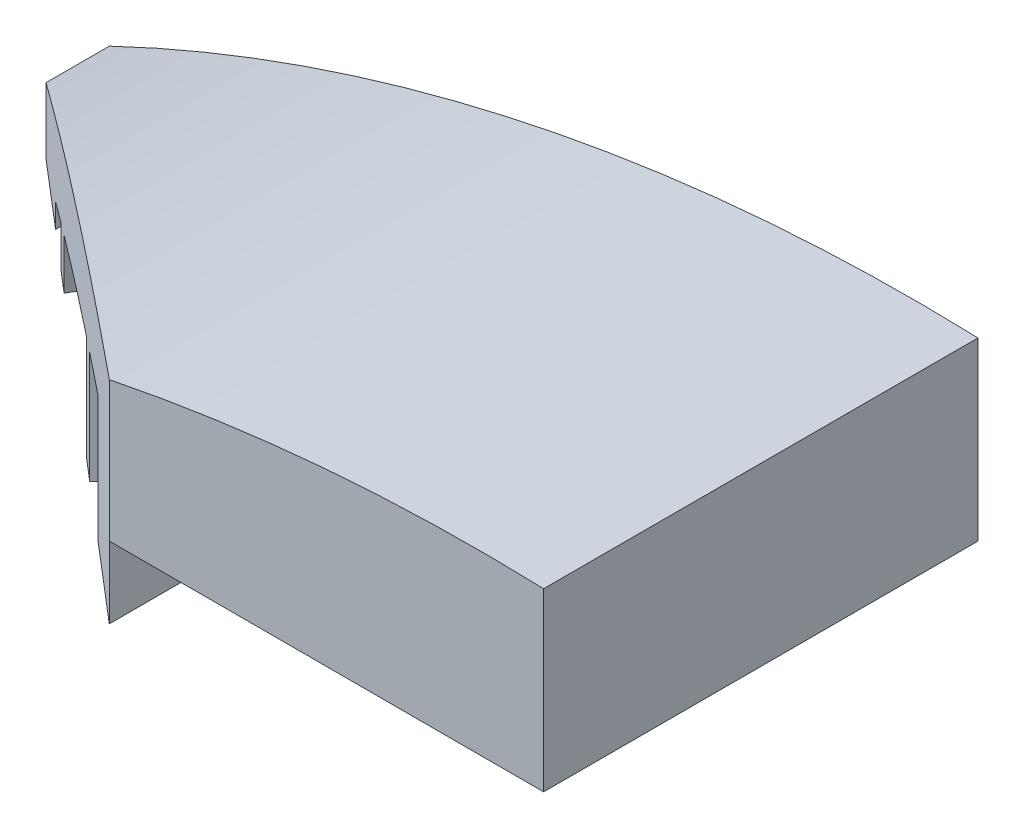
ISO-10303-21;
HEADER;
FILE_DESCRIPTION(('STEP AP214'),'2;1');
FILE_NAME('part.step','',(''),(''),'','','');
FILE_SCHEMA(('AUTOMOTIVE_DESIGN { 1 0 10303 214 1 1 1 1 }'));
ENDSEC;
DATA;
#1=APPLICATION_CONTEXT('core data for automotive mechanical design processes');
#2=APPLICATION_PROTOCOL_DEFINITION('international standard','automotive_design',2000,#1);
#3=PRODUCT_CONTEXT('',#1,'mechanical');
#4=PRODUCT('Part','Part','',(#3));
#5=PRODUCT_RELATED_PRODUCT_CATEGORY('part','',(#4));
#6=PRODUCT_DEFINITION_FORMATION('','',#4);
#7=PRODUCT_DEFINITION_CONTEXT('part definition',#1,'design');
#8=PRODUCT_DEFINITION('design','',#6,#7);
#9=PRODUCT_DEFINITION_SHAPE('','',#8);
#10=(LENGTH_UNIT() NAMED_UNIT(*) SI_UNIT(.MILLI.,.METRE.));
#11=(NAMED_UNIT(*) PLANE_ANGLE_UNIT() SI_UNIT($,.RADIAN.));
#12=(NAMED_UNIT(*) SI_UNIT($,.STERADIAN.) SOLID_ANGLE_UNIT());
#13=UNCERTAINTY_MEASURE_WITH_UNIT(LENGTH_MEASURE(1.E-05),#10,'distance_accuracy_value','');
#14=(GEOMETRIC_REPRESENTATION_CONTEXT(3) GLOBAL_UNCERTAINTY_ASSIGNED_CONTEXT((#13)) GLOBAL_UNIT_ASSIGNED_CONTEXT((#10,
#11,#12)) REPRESENTATION_CONTEXT('',''));
#15=CARTESIAN_POINT('',(0.,0.,0.));
#16=DIRECTION('',(0.,0.,1.));
#17=DIRECTION('',(1.,0.,0.));
#18=AXIS2_PLACEMENT_3D('',#15,#16,#17);
#19=CARTESIAN_POINT('',(-7.9,1.03720809548521,3.95));
#20=DIRECTION('',(0.,1.,0.));
#21=DIRECTION('',(0.,0.,1.));
#22=AXIS2_PLACEMENT_3D('',#19,#20,#21);
#23=PLANE('',#22);
#24=DIRECTION('',(0.,0.,-1.));
#25=VECTOR('',#24,1.);
#26=CARTESIAN_POINT('',(0.,1.03720809548521,3.95));
#27=LINE('',#26,#25);
#28=CARTESIAN_POINT('',(0.,1.03720809548521,3.95));
#29=VERTEX_POINT('',#28);
#30=CARTESIAN_POINT('',(0.,1.03720809548521,-3.95));
#31=VERTEX_POINT('',#30);
#32=EDGE_CURVE('E260',#29,#31,#27,.T.);
#33=ORIENTED_EDGE('',*,*,#32,.F.);
#34=DIRECTION('',(-0.760337182849053,0.,-0.649528573949727));
#35=VECTOR('',#34,1.);
#36=CARTESIAN_POINT('',(-4.5670897898204,1.03720809548521,0.0485002638345054));
#37=LINE('',#36,#35);
#38=CARTESIAN_POINT('',(-1.40471821566003,1.03720809548521,2.75));
#39=VERTEX_POINT('',#38);
#40=EDGE_CURVE('E224',#29,#39,#37,.T.);
#41=ORIENTED_EDGE('',*,*,#40,.T.);
#42=DIRECTION('',(1.,0.,0.));
#43=VECTOR('',#42,1.);
#44=CARTESIAN_POINT('',(6.73873493519161,1.03720809548521,2.75));
#45=LINE('',#44,#43);
#46=CARTESIAN_POINT('',(-1.2,1.03720809548521,2.75));
#47=VERTEX_POINT('',#46);
#48=EDGE_CURVE('E314',#39,#47,#45,.T.);
#49=ORIENTED_EDGE('',*,*,#48,.T.);
#50=DIRECTION('',(0.,0.,-1.));
#51=VECTOR('',#50,1.);
#52=CARTESIAN_POINT('',(-1.2,1.03720809548521,3.95));
#53=LINE('',#52,#51);
#54=CARTESIAN_POINT('',(-1.2,1.03720809548521,-2.75));
#55=VERTEX_POINT('',#54);
#56=EDGE_CURVE('E309',#47,#55,#53,.T.);
#57=ORIENTED_EDGE('',*,*,#56,.T.);
#58=DIRECTION('',(1.,0.,0.));
#59=VECTOR('',#58,1.);
#60=CARTESIAN_POINT('',(6.73873493519161,1.03720809548521,-2.75));
#61=LINE('',#60,#59);
#62=CARTESIAN_POINT('',(-6.7,1.03720809548521,-2.75));
#63=VERTEX_POINT('',#62);
#64=EDGE_CURVE('E306',#63,#55,#61,.T.);
#65=ORIENTED_EDGE('',*,*,#64,.F.);
#66=DIRECTION('',(0.,0.,-1.));
#67=VECTOR('',#66,1.);
#68=CARTESIAN_POINT('',(-6.7,1.03720809548521,3.95));
#69=LINE('',#68,#67);
#70=CARTESIAN_POINT('',(-6.7,1.03720809548521,-1.77356783756967));
#71=VERTEX_POINT('',#70);
#72=EDGE_CURVE('E330',#71,#63,#69,.T.);
#73=ORIENTED_EDGE('',*,*,#72,.F.);
#74=CARTESIAN_POINT('',(-7.9,1.03720809548521,-2.79868446519408));
#75=VERTEX_POINT('',#74);
#76=EDGE_CURVE('E374',#71,#75,#37,.T.);
#77=ORIENTED_EDGE('',*,*,#76,.T.);
#78=DIRECTION('',(0.,0.,-1.));
#79=VECTOR('',#78,1.);
#80=CARTESIAN_POINT('',(-7.9,1.03720809548521,3.95));
#81=LINE('',#80,#79);
#82=CARTESIAN_POINT('',(-7.9,1.03720809548521,-3.95));
#83=VERTEX_POINT('',#82);
#84=EDGE_CURVE('E263',#75,#83,#81,.T.);
#85=ORIENTED_EDGE('',*,*,#84,.T.);
#86=DIRECTION('',(1.,0.,0.));
#87=VECTOR('',#86,1.);
#88=CARTESIAN_POINT('',(-7.9,1.03720809548521,-3.95));
#89=LINE('',#88,#87);
#90=EDGE_CURVE('E240',#83,#31,#89,.T.);
#91=ORIENTED_EDGE('',*,*,#90,.T.);
#92=EDGE_LOOP('',(#33,#41,#49,#57,#65,#73,#77,#85,#91));
#93=FACE_BOUND('',#92,.T.);
#94=ADVANCED_FACE('F53',(#93),#23,.F.);
#95=CARTESIAN_POINT('',(-7.9,1.03720809548521,3.95));
#96=DIRECTION('',(1.,0.,0.));
#97=DIRECTION('',(0.,0.,-1.));
#98=AXIS2_PLACEMENT_3D('',#95,#96,#97);
#99=PLANE('',#98);
#100=ORIENTED_EDGE('',*,*,#84,.F.);
#101=DIRECTION('',(0.,-1.,0.));
#102=VECTOR('',#101,1.);
#103=CARTESIAN_POINT('',(-7.9,5.56078833662162,-2.79868446519408));
#104=LINE('',#103,#102);
#105=CARTESIAN_POINT('',(-7.9,2.23720809548521,-2.79868446519408));
#106=VERTEX_POINT('',#105);
#107=EDGE_CURVE('E213',#106,#75,#104,.T.);
#108=ORIENTED_EDGE('',*,*,#107,.F.);
#109=DIRECTION('',(0.,0.,-1.));
#110=VECTOR('',#109,1.);
#111=CARTESIAN_POINT('',(-7.9,2.23720809548521,3.95));
#112=LINE('',#111,#110);
#113=CARTESIAN_POINT('',(-7.9,2.23720809548521,-3.95));
#114=VERTEX_POINT('',#113);
#115=EDGE_CURVE('E222',#106,#114,#112,.T.);
#116=ORIENTED_EDGE('',*,*,#115,.T.);
#117=DIRECTION('',(0.,-1.,0.));
#118=VECTOR('',#117,1.);
#119=CARTESIAN_POINT('',(-7.9,1.03720809548521,-3.95));
#120=LINE('',#119,#118);
#121=EDGE_CURVE('E237',#114,#83,#120,.T.);
#122=ORIENTED_EDGE('',*,*,#121,.T.);
#123=EDGE_LOOP('',(#100,#108,#116,#122));
#124=FACE_BOUND('',#123,.T.);
#125=ADVANCED_FACE('F55',(#124),#99,.F.);
#126=CARTESIAN_POINT('',(0.,1.03720809548521,3.95));
#127=DIRECTION('',(-1.,0.,0.));
#128=DIRECTION('',(0.,0.,1.));
#129=AXIS2_PLACEMENT_3D('',#126,#127,#128);
#130=PLANE('',#129);
#131=DIRECTION('',(0.,1.,0.));
#132=VECTOR('',#131,1.);
#133=CARTESIAN_POINT('',(0.,1.03720809548521,-3.95));
#134=LINE('',#133,#132);
#135=CARTESIAN_POINT('',(0.,2.34089257913856,-3.95));
#136=VERTEX_POINT('',#135);
#137=EDGE_CURVE('E243',#31,#136,#134,.T.);
#138=ORIENTED_EDGE('',*,*,#137,.T.);
#139=DIRECTION('',(0.,0.,-1.));
#140=VECTOR('',#139,1.);
#141=CARTESIAN_POINT('',(0.,2.34089257913856,3.95));
#142=LINE('',#141,#140);
#143=CARTESIAN_POINT('',(0.,2.34089257913856,-2.76982131033317));
#144=VERTEX_POINT('',#143);
#145=EDGE_CURVE('E256',#144,#136,#142,.T.);
#146=ORIENTED_EDGE('',*,*,#145,.F.);
#147=DIRECTION('',(0.,-1.,0.));
#148=VECTOR('',#147,1.);
#149=CARTESIAN_POINT('',(0.,4.74089257913856,-2.76982131033317));
#150=LINE('',#149,#148);
#151=CARTESIAN_POINT('',(0.,4.74089257913856,-2.76982131033317));
#152=VERTEX_POINT('',#151);
#153=EDGE_CURVE('E75',#152,#144,#150,.T.);
#154=ORIENTED_EDGE('',*,*,#153,.F.);
#155=DIRECTION('',(0.,0.,-1.));
#156=VECTOR('',#155,1.);
#157=CARTESIAN_POINT('',(0.,4.74089257913856,2.81210865858254));
#158=LINE('',#157,#156);
#159=CARTESIAN_POINT('',(0.,4.74089257913856,2.81210865858254));
#160=VERTEX_POINT('',#159);
#161=EDGE_CURVE('E389',#160,#152,#158,.T.);
#162=ORIENTED_EDGE('',*,*,#161,.F.);
#163=DIRECTION('',(0.,-1.,0.));
#164=VECTOR('',#163,1.);
#165=CARTESIAN_POINT('',(0.,4.74089257913856,2.81210865858254));
#166=LINE('',#165,#164);
#167=CARTESIAN_POINT('',(0.,2.34089257913856,2.81210865858254));
#168=VERTEX_POINT('',#167);
#169=EDGE_CURVE('E408',#160,#168,#166,.T.);
#170=ORIENTED_EDGE('',*,*,#169,.T.);
#171=CARTESIAN_POINT('',(0.,2.34089257913856,3.95));
#172=VERTEX_POINT('',#171);
#173=EDGE_CURVE('E257',#172,#168,#142,.T.);
#174=ORIENTED_EDGE('',*,*,#173,.F.);
#175=DIRECTION('',(0.,1.,0.));
#176=VECTOR('',#175,1.);
#177=CARTESIAN_POINT('',(0.,1.03720809548521,3.95));
#178=LINE('',#177,#176);
#179=EDGE_CURVE('E209',#29,#172,#178,.T.);
#180=ORIENTED_EDGE('',*,*,#179,.F.);
#181=ORIENTED_EDGE('',*,*,#32,.T.);
#182=EDGE_LOOP('',(#138,#146,#154,#162,#170,#174,#180,#181));
#183=FACE_BOUND('',#182,.T.);
#184=DIRECTION('',(0.,0.,1.));
#185=VECTOR('',#184,1.);
#186=CARTESIAN_POINT('',(0.,3.54089257913856,3.95));
#187=LINE('',#186,#185);
#188=CARTESIAN_POINT('',(0.,3.54089257913856,-2.75));
#189=VERTEX_POINT('',#188);
#190=CARTESIAN_POINT('',(0.,3.54089257913856,2.75));
#191=VERTEX_POINT('',#190);
#192=EDGE_CURVE('E417',#189,#191,#187,.T.);
#193=ORIENTED_EDGE('',*,*,#192,.T.);
#194=DIRECTION('',(0.,1.,0.));
#195=VECTOR('',#194,1.);
#196=CARTESIAN_POINT('',(0.,-28.339212531873,2.75));
#197=LINE('',#196,#195);
#198=CARTESIAN_POINT('',(0.,3.65890472950313,2.75));
#199=VERTEX_POINT('',#198);
#200=EDGE_CURVE('E273',#191,#199,#197,.T.);
#201=ORIENTED_EDGE('',*,*,#200,.T.);
#202=DIRECTION('',(0.,0.,-1.));
#203=VECTOR('',#202,1.);
#204=CARTESIAN_POINT('',(0.,3.65890472950313,3.95));
#205=LINE('',#204,#203);
#206=CARTESIAN_POINT('',(0.,3.65890472950313,-2.75));
#207=VERTEX_POINT('',#206);
#208=EDGE_CURVE('E410',#199,#207,#205,.T.);
#209=ORIENTED_EDGE('',*,*,#208,.T.);
#210=DIRECTION('',(0.,1.,0.));
#211=VECTOR('',#210,1.);
#212=CARTESIAN_POINT('',(0.,-28.339212531873,-2.75));
#213=LINE('',#212,#211);
#214=EDGE_CURVE('E419',#189,#207,#213,.T.);
#215=ORIENTED_EDGE('',*,*,#214,.F.);
#216=EDGE_LOOP('',(#193,#201,#209,#215));
#217=FACE_BOUND('',#216,.T.);
#218=ADVANCED_FACE('F453',(#183,#217),#130,.F.);
#219=CARTESIAN_POINT('',(0.,2.34089257913856,3.95));
#220=DIRECTION('',(0.,1.,0.));
#221=DIRECTION('',(0.,0.,1.));
#222=AXIS2_PLACEMENT_3D('',#219,#220,#221);
#223=PLANE('',#222);
#224=ORIENTED_EDGE('',*,*,#173,.T.);
#225=DIRECTION('',(-1.,0.,0.));
#226=VECTOR('',#225,1.);
#227=CARTESIAN_POINT('',(0.,2.34089257913856,2.81210865858254));
#228=LINE('',#227,#226);
#229=CARTESIAN_POINT('',(6.82392747067494,2.34089257913856,2.81210865858254));
#230=VERTEX_POINT('',#229);
#231=EDGE_CURVE('E393',#230,#168,#228,.T.);
#232=ORIENTED_EDGE('',*,*,#231,.F.);
#233=DIRECTION('',(0.,0.,1.));
#234=VECTOR('',#233,1.);
#235=CARTESIAN_POINT('',(6.82392747067494,2.34089257913856,2.81210865858254));
#236=LINE('',#235,#234);
#237=CARTESIAN_POINT('',(6.82392747067494,2.34089257913856,-2.76982131033317));
#238=VERTEX_POINT('',#237);
#239=EDGE_CURVE('E403',#238,#230,#236,.T.);
#240=ORIENTED_EDGE('',*,*,#239,.F.);
#241=DIRECTION('',(1.,0.,0.));
#242=VECTOR('',#241,1.);
#243=CARTESIAN_POINT('',(6.82392747067494,2.34089257913856,-2.76982131033317));
#244=LINE('',#243,#242);
#245=EDGE_CURVE('E388',#144,#238,#244,.T.);
#246=ORIENTED_EDGE('',*,*,#245,.F.);
#247=ORIENTED_EDGE('',*,*,#145,.T.);
#248=DIRECTION('',(1.,0.,0.));
#249=VECTOR('',#248,1.);
#250=CARTESIAN_POINT('',(0.,2.34089257913856,-3.95));
#251=LINE('',#250,#249);
#252=CARTESIAN_POINT('',(7.9,2.34089257913856,-3.95));
#253=VERTEX_POINT('',#252);
#254=EDGE_CURVE('E246',#136,#253,#251,.T.);
#255=ORIENTED_EDGE('',*,*,#254,.T.);
#256=DIRECTION('',(0.,0.,-1.));
#257=VECTOR('',#256,1.);
#258=CARTESIAN_POINT('',(7.9,2.34089257913856,3.95));
#259=LINE('',#258,#257);
#260=CARTESIAN_POINT('',(7.9,2.34089257913856,3.95));
#261=VERTEX_POINT('',#260);
#262=EDGE_CURVE('E253',#261,#253,#259,.T.);
#263=ORIENTED_EDGE('',*,*,#262,.F.);
#264=DIRECTION('',(1.,0.,0.));
#265=VECTOR('',#264,1.);
#266=CARTESIAN_POINT('',(0.,2.34089257913856,3.95));
#267=LINE('',#266,#265);
#268=EDGE_CURVE('E233',#172,#261,#267,.T.);
#269=ORIENTED_EDGE('',*,*,#268,.F.);
#270=EDGE_LOOP('',(#224,#232,#240,#246,#247,#255,#263,#269));
#271=FACE_BOUND('',#270,.T.);
#272=ADVANCED_FACE('F344',(#271),#223,.F.);
#273=CARTESIAN_POINT('',(7.9,2.34089257913856,3.95));
#274=DIRECTION('',(-1.,0.,0.));
#275=DIRECTION('',(0.,0.,1.));
#276=AXIS2_PLACEMENT_3D('',#273,#274,#275);
#277=PLANE('',#276);
#278=DIRECTION('',(0.,1.,0.));
#279=VECTOR('',#278,1.);
#280=CARTESIAN_POINT('',(7.9,2.34089257913856,-3.95));
#281=LINE('',#280,#279);
#282=CARTESIAN_POINT('',(7.9,5.54089257913856,-3.95));
#283=VERTEX_POINT('',#282);
#284=EDGE_CURVE('E248',#253,#283,#281,.T.);
#285=ORIENTED_EDGE('',*,*,#284,.T.);
#286=DIRECTION('',(0.,0.,-1.));
#287=VECTOR('',#286,1.);
#288=CARTESIAN_POINT('',(7.9,5.54089257913856,3.95));
#289=LINE('',#288,#287);
#290=CARTESIAN_POINT('',(7.9,5.54089257913856,3.95));
#291=VERTEX_POINT('',#290);
#292=EDGE_CURVE('E231',#291,#283,#289,.T.);
#293=ORIENTED_EDGE('',*,*,#292,.F.);
#294=DIRECTION('',(0.,1.,0.));
#295=VECTOR('',#294,1.);
#296=CARTESIAN_POINT('',(7.9,2.34089257913856,3.95));
#297=LINE('',#296,#295);
#298=EDGE_CURVE('E228',#261,#291,#297,.T.);
#299=ORIENTED_EDGE('',*,*,#298,.F.);
#300=ORIENTED_EDGE('',*,*,#262,.T.);
#301=EDGE_LOOP('',(#285,#293,#299,#300));
#302=FACE_BOUND('',#301,.T.);
#303=ADVANCED_FACE('F348',(#302),#277,.F.);
#304=CARTESIAN_POINT('',(6.73873493519161,-28.339212531873,3.95));
#305=DIRECTION('',(0.,0.,-1.));
#306=DIRECTION('',(-1.,0.,0.));
#307=AXIS2_PLACEMENT_3D('',#304,#305,#306);
#308=CYLINDRICAL_SURFACE('',#307,33.9000008684946);
#309=ORIENTED_EDGE('',*,*,#115,.F.);
#310=CARTESIAN_POINT('',(6.73873493519161,-28.339212531873,9.70665769268206));
#311=DIRECTION('',(0.649528573949726,0.,-0.760337182849053));
#312=DIRECTION('',(-0.760337182849053,0.,-0.649528573949727));
#313=AXIS2_PLACEMENT_3D('',#310,#311,#312);
#314=ELLIPSE('',#313,44.5854834317956,33.9000008684946);
#315=CARTESIAN_POINT('',(0.,4.88426576822622,3.95));
#316=VERTEX_POINT('',#315);
#317=EDGE_CURVE('E206',#106,#316,#314,.T.);
#318=ORIENTED_EDGE('',*,*,#317,.T.);
#319=CARTESIAN_POINT('',(6.73873493519161,-28.339212531873,3.95));
#320=DIRECTION('',(0.,0.,1.));
#321=DIRECTION('',(-1.,0.,0.));
#322=AXIS2_PLACEMENT_3D('',#319,#320,#321);
#323=CIRCLE('',#322,33.9000008684946);
#324=EDGE_CURVE('E220',#291,#316,#323,.T.);
#325=ORIENTED_EDGE('',*,*,#324,.F.);
#326=ORIENTED_EDGE('',*,*,#292,.T.);
#327=CARTESIAN_POINT('',(6.73873493519161,-28.339212531873,-3.95));
#328=DIRECTION('',(0.,0.,1.));
#329=DIRECTION('',(-1.,0.,0.));
#330=AXIS2_PLACEMENT_3D('',#327,#328,#329);
#331=CIRCLE('',#330,33.9000008684946);
#332=EDGE_CURVE('E250',#283,#114,#331,.T.);
#333=ORIENTED_EDGE('',*,*,#332,.T.);
#334=EDGE_LOOP('',(#309,#318,#325,#326,#333));
#335=FACE_BOUND('',#334,.T.);
#336=ADVANCED_FACE('F218',(#335),#308,.T.);
#337=CARTESIAN_POINT('',(6.73873493519161,-28.339212531873,3.95));
#338=DIRECTION('',(0.,0.,-1.));
#339=DIRECTION('',(-1.,0.,0.));
#340=AXIS2_PLACEMENT_3D('',#337,#338,#339);
#341=PLANE('',#340);
#342=ORIENTED_EDGE('',*,*,#324,.T.);
#343=DIRECTION('',(0.,-1.,0.));
#344=VECTOR('',#343,1.);
#345=CARTESIAN_POINT('',(0.,5.56078833662162,3.95));
#346=LINE('',#345,#344);
#347=EDGE_CURVE('E203',#316,#172,#346,.T.);
#348=ORIENTED_EDGE('',*,*,#347,.T.);
#349=ORIENTED_EDGE('',*,*,#268,.T.);
#350=ORIENTED_EDGE('',*,*,#298,.T.);
#351=EDGE_LOOP('',(#342,#348,#349,#350));
#352=FACE_BOUND('',#351,.T.);
#353=ADVANCED_FACE('F226',(#352),#341,.F.);
#354=CARTESIAN_POINT('',(6.73873493519161,-28.339212531873,-3.95));
#355=DIRECTION('',(0.,0.,-1.));
#356=DIRECTION('',(-1.,0.,0.));
#357=AXIS2_PLACEMENT_3D('',#354,#355,#356);
#358=PLANE('',#357);
#359=ORIENTED_EDGE('',*,*,#121,.F.);
#360=ORIENTED_EDGE('',*,*,#332,.F.);
#361=ORIENTED_EDGE('',*,*,#284,.F.);
#362=ORIENTED_EDGE('',*,*,#254,.F.);
#363=ORIENTED_EDGE('',*,*,#137,.F.);
#364=ORIENTED_EDGE('',*,*,#90,.F.);
#365=EDGE_LOOP('',(#359,#360,#361,#362,#363,#364));
#366=FACE_BOUND('',#365,.T.);
#367=ADVANCED_FACE('F352',(#366),#358,.T.);
#368=CARTESIAN_POINT('',(6.73873493519161,-28.339212531873,-2.75));
#369=DIRECTION('',(0.,0.,-1.));
#370=DIRECTION('',(-1.,0.,0.));
#371=AXIS2_PLACEMENT_3D('',#368,#369,#370);
#372=PLANE('',#371);
#373=DIRECTION('',(0.,-1.,0.));
#374=VECTOR('',#373,1.);
#375=CARTESIAN_POINT('',(-6.7,-28.339212531873,-2.75));
#376=LINE('',#375,#374);
#377=CARTESIAN_POINT('',(-6.7,1.47169923112427,-2.75));
#378=VERTEX_POINT('',#377);
#379=EDGE_CURVE('E300',#378,#63,#376,.T.);
#380=ORIENTED_EDGE('',*,*,#379,.T.);
#381=ORIENTED_EDGE('',*,*,#64,.T.);
#382=DIRECTION('',(0.,1.,0.));
#383=VECTOR('',#382,1.);
#384=CARTESIAN_POINT('',(-1.2,-28.339212531873,-2.75));
#385=LINE('',#384,#383);
#386=CARTESIAN_POINT('',(-1.2,3.38249209490134,-2.75));
#387=VERTEX_POINT('',#386);
#388=EDGE_CURVE('E321',#55,#387,#385,.T.);
#389=ORIENTED_EDGE('',*,*,#388,.T.);
#390=CARTESIAN_POINT('',(6.73873493519161,-28.339212531873,-2.75));
#391=DIRECTION('',(0.,0.,-1.));
#392=DIRECTION('',(-1.,0.,0.));
#393=AXIS2_PLACEMENT_3D('',#390,#391,#392);
#394=CIRCLE('',#393,32.7000008684946);
#395=EDGE_CURVE('E311',#387,#378,#394,.F.);
#396=ORIENTED_EDGE('',*,*,#395,.T.);
#397=EDGE_LOOP('',(#380,#381,#389,#396));
#398=FACE_BOUND('',#397,.T.);
#399=ADVANCED_FACE('F481',(#398),#372,.F.);
#400=CARTESIAN_POINT('',(-1.2,1.03720809548521,3.95));
#401=DIRECTION('',(-1.,0.,0.));
#402=DIRECTION('',(0.,0.,1.));
#403=AXIS2_PLACEMENT_3D('',#400,#401,#402);
#404=PLANE('',#403);
#405=ORIENTED_EDGE('',*,*,#388,.F.);
#406=ORIENTED_EDGE('',*,*,#56,.F.);
#407=DIRECTION('',(0.,1.,0.));
#408=VECTOR('',#407,1.);
#409=CARTESIAN_POINT('',(-1.2,-28.339212531873,2.75));
#410=LINE('',#409,#408);
#411=CARTESIAN_POINT('',(-1.2,3.38249209490134,2.75));
#412=VERTEX_POINT('',#411);
#413=EDGE_CURVE('E325',#47,#412,#410,.T.);
#414=ORIENTED_EDGE('',*,*,#413,.T.);
#415=DIRECTION('',(0.,0.,-1.));
#416=VECTOR('',#415,1.);
#417=CARTESIAN_POINT('',(-1.2,3.38249209490134,3.95));
#418=LINE('',#417,#416);
#419=EDGE_CURVE('E241',#387,#412,#418,.F.);
#420=ORIENTED_EDGE('',*,*,#419,.F.);
#421=EDGE_LOOP('',(#405,#406,#414,#420));
#422=FACE_BOUND('',#421,.T.);
#423=ADVANCED_FACE('F446',(#422),#404,.T.);
#424=CARTESIAN_POINT('',(-6.7,1.03720809548521,3.95));
#425=DIRECTION('',(1.,0.,0.));
#426=DIRECTION('',(0.,0.,-1.));
#427=AXIS2_PLACEMENT_3D('',#424,#425,#426);
#428=PLANE('',#427);
#429=DIRECTION('',(0.,1.,0.));
#430=VECTOR('',#429,1.);
#431=CARTESIAN_POINT('',(-6.7,1.03720809548521,-1.77356783756967));
#432=LINE('',#431,#430);
#433=CARTESIAN_POINT('',(-6.7,1.47169923112427,-1.77356783756967));
#434=VERTEX_POINT('',#433);
#435=EDGE_CURVE('E371',#71,#434,#432,.T.);
#436=ORIENTED_EDGE('',*,*,#435,.F.);
#437=ORIENTED_EDGE('',*,*,#72,.T.);
#438=ORIENTED_EDGE('',*,*,#379,.F.);
#439=DIRECTION('',(0.,0.,-1.));
#440=VECTOR('',#439,1.);
#441=CARTESIAN_POINT('',(-6.7,1.47169923112427,2.75));
#442=LINE('',#441,#440);
#443=EDGE_CURVE('E307',#434,#378,#442,.T.);
#444=ORIENTED_EDGE('',*,*,#443,.F.);
#445=EDGE_LOOP('',(#436,#437,#438,#444));
#446=FACE_BOUND('',#445,.T.);
#447=ADVANCED_FACE('F290',(#446),#428,.T.);
#448=CARTESIAN_POINT('',(6.73873493519161,-28.339212531873,2.75));
#449=DIRECTION('',(0.,0.,-1.));
#450=DIRECTION('',(-1.,0.,0.));
#451=AXIS2_PLACEMENT_3D('',#448,#449,#450);
#452=PLANE('',#451);
#453=DIRECTION('',(0.,-1.,0.));
#454=VECTOR('',#453,1.);
#455=CARTESIAN_POINT('',(-1.40471821566003,-28.339212531873,2.75));
#456=LINE('',#455,#454);
#457=CARTESIAN_POINT('',(-1.40471821566003,3.33055582186513,2.75));
#458=VERTEX_POINT('',#457);
#459=EDGE_CURVE('E378',#458,#39,#456,.T.);
#460=ORIENTED_EDGE('',*,*,#459,.F.);
#461=CARTESIAN_POINT('',(6.73873493519161,-28.339212531873,2.75));
#462=DIRECTION('',(0.,0.,-1.));
#463=DIRECTION('',(-1.,0.,0.));
#464=AXIS2_PLACEMENT_3D('',#461,#462,#463);
#465=CIRCLE('',#464,32.7000008684946);
#466=EDGE_CURVE('E317',#412,#458,#465,.F.);
#467=ORIENTED_EDGE('',*,*,#466,.F.);
#468=ORIENTED_EDGE('',*,*,#413,.F.);
#469=ORIENTED_EDGE('',*,*,#48,.F.);
#470=EDGE_LOOP('',(#460,#467,#468,#469));
#471=FACE_BOUND('',#470,.T.);
#472=ADVANCED_FACE('F442',(#471),#452,.T.);
#473=CARTESIAN_POINT('',(6.73873493519161,-28.339212531873,3.95));
#474=DIRECTION('',(0.,0.,-1.));
#475=DIRECTION('',(-1.,0.,0.));
#476=AXIS2_PLACEMENT_3D('',#473,#474,#475);
#477=CYLINDRICAL_SURFACE('',#476,32.7000008684946);
#478=CARTESIAN_POINT('',(6.73873493519161,-28.339212531873,9.70665769268206));
#479=DIRECTION('',(0.649528573949726,0.,-0.760337182849053));
#480=DIRECTION('',(-0.760337182849053,0.,-0.649528573949727));
#481=AXIS2_PLACEMENT_3D('',#478,#479,#480);
#482=ELLIPSE('',#481,43.0072362711037,32.7000008684946);
#483=CARTESIAN_POINT('',(-6.02850105778361,1.76540076740767,-1.19993056165447));
#484=VERTEX_POINT('',#483);
#485=EDGE_CURVE('E369',#434,#484,#482,.T.);
#486=ORIENTED_EDGE('',*,*,#485,.F.);
#487=ORIENTED_EDGE('',*,*,#443,.T.);
#488=ORIENTED_EDGE('',*,*,#395,.F.);
#489=ORIENTED_EDGE('',*,*,#419,.T.);
#490=ORIENTED_EDGE('',*,*,#466,.T.);
#491=CARTESIAN_POINT('',(-2.44008846820228,3.04612254247115,1.86552061530937));
#492=VERTEX_POINT('',#491);
#493=EDGE_CURVE('E372',#492,#458,#482,.T.);
#494=ORIENTED_EDGE('',*,*,#493,.F.);
#495=CARTESIAN_POINT('',(-3.95,2.5645251431197,-2.4));
#496=CARTESIAN_POINT('',(-3.81169258548664,2.61236046095251,-2.39999508594455));
#497=CARTESIAN_POINT('',(-3.67297547781243,2.65929017349614,-2.38801677351897));
#498=CARTESIAN_POINT('',(-3.39862214079474,2.75009397367823,-2.33995843063229));
#499=CARTESIAN_POINT('',(-3.26298888083205,2.79396519388227,-2.30385610999274));
#500=CARTESIAN_POINT('',(-2.99876248699016,2.87761673628553,-2.20792196844472));
#501=CARTESIAN_POINT('',(-2.87017960452805,2.91739117176452,-2.14805658507075));
#502=CARTESIAN_POINT('',(-2.62452746846685,2.99185610672771,-2.00580498495848));
#503=CARTESIAN_POINT('',(-2.50745414156755,3.0265484069556,-1.92342677494047));
#504=CARTESIAN_POINT('',(-2.29281400394808,3.08901138574904,-1.74149995783847));
#505=CARTESIAN_POINT('',(-2.19470306952646,3.11698373599405,-1.64266304081114));
#506=CARTESIAN_POINT('',(-2.01649035277433,3.16705158855202,-1.42860803768024));
#507=CARTESIAN_POINT('',(-1.9363848209199,3.18914831460643,-1.31339337032418));
#508=CARTESIAN_POINT('',(-1.80007054698245,3.2263329223074,-1.07510615699604));
#509=CARTESIAN_POINT('',(-1.74300086707473,3.24167577025755,-0.952565430298334));
#510=CARTESIAN_POINT('',(-1.65012186986488,3.2664747363378,-0.699117753250783));
#511=CARTESIAN_POINT('',(-1.61430885535275,3.27593187819324,-0.568212262189302));
#512=CARTESIAN_POINT('',(-1.56588288701138,3.28868644647392,-0.305528446431888));
#513=CARTESIAN_POINT('',(-1.55267484079916,3.29214190924572,-0.173867184474623));
#514=CARTESIAN_POINT('',(-1.54806037229135,3.29335120669595,0.0898582220528112));
#515=CARTESIAN_POINT('',(-1.55665217700554,3.29110550505226,0.221922332986598));
#516=CARTESIAN_POINT('',(-1.59515027372246,3.28098349624471,0.481371059871817));
#517=CARTESIAN_POINT('',(-1.62485026969609,3.27316168366183,0.608788516065781));
#518=CARTESIAN_POINT('',(-1.70433723611362,3.25202466102413,0.856705647332899));
#519=CARTESIAN_POINT('',(-1.75412419955238,3.23870945288508,0.977205324818547));
#520=CARTESIAN_POINT('',(-1.87252507930352,3.20662753256158,1.20876684340515));
#521=CARTESIAN_POINT('',(-1.94125863190137,3.18782613265533,1.31976263189244));
#522=CARTESIAN_POINT('',(-2.0951780671768,3.14504385370593,1.52854890664151));
#523=CARTESIAN_POINT('',(-2.18036522404228,3.12106257350928,1.62633836919151));
#524=CARTESIAN_POINT('',(-2.36660842478771,3.06767125032935,1.80837013828896));
#525=CARTESIAN_POINT('',(-2.46797688055352,3.03815174706123,1.89226037922288));
#526=CARTESIAN_POINT('',(-2.68203027675044,2.9745495691371,2.04189002055022));
#527=CARTESIAN_POINT('',(-2.79471700123389,2.94046617481064,2.10762655330667));
#528=CARTESIAN_POINT('',(-3.03252127959364,2.86701508714344,2.22177084489388));
#529=CARTESIAN_POINT('',(-3.15794519690244,2.82749806735694,2.26944367931937));
#530=CARTESIAN_POINT('',(-3.41391787088652,2.7450565875879,2.34315345186629));
#531=CARTESIAN_POINT('',(-3.54446775563965,2.70213137541169,2.36918559923018));
#532=CARTESIAN_POINT('',(-3.81317682513417,2.61184850135446,2.40007909690781));
#533=CARTESIAN_POINT('',(-3.95141399596343,2.56437829333676,2.40393465517342));
#534=CARTESIAN_POINT('',(-4.22603058425006,2.46801342040489,2.38804035626149));
#535=CARTESIAN_POINT('',(-4.36240955776632,2.41911842355821,2.36828495485301));
#536=CARTESIAN_POINT('',(-4.6345547257389,2.31955561123151,2.30468977889422));
#537=CARTESIAN_POINT('',(-4.77012728032016,2.26888648302156,2.26001987364074));
#538=CARTESIAN_POINT('',(-5.03177696894899,2.16922441364816,2.14710619983222));
#539=CARTESIAN_POINT('',(-5.15785284881105,2.12023169434557,2.07885932419223));
#540=CARTESIAN_POINT('',(-5.39683432597368,2.02580916613491,1.92022007048584));
#541=CARTESIAN_POINT('',(-5.50973499960054,1.98038069127675,1.82981945227365));
#542=CARTESIAN_POINT('',(-5.71852956387105,1.89519422246801,1.62888767680927));
#543=CARTESIAN_POINT('',(-5.81442791733631,1.85543474104057,1.51836181757826));
#544=CARTESIAN_POINT('',(-5.98111525217538,1.78558198614827,1.28606303349325));
#545=CARTESIAN_POINT('',(-6.05293246273827,1.75510021849103,1.16514690969886));
#546=CARTESIAN_POINT('',(-6.17481175724703,1.70300434660068,0.911058765937991));
#547=CARTESIAN_POINT('',(-6.22488753679036,1.68138466035048,0.777894525700224));
#548=CARTESIAN_POINT('',(-6.2978217625467,1.64978051053942,0.514656103346121));
#549=CARTESIAN_POINT('',(-6.32254253320756,1.63900128658872,0.385192125662812));
#550=CARTESIAN_POINT('',(-6.35042179129965,1.62683958681406,0.123543140580643));
#551=CARTESIAN_POINT('',(-6.35358852549708,1.62545351708655,-0.00864080671516675));
#552=CARTESIAN_POINT('',(-6.33865105915724,1.631974932848,-0.26428730265916));
#553=CARTESIAN_POINT('',(-6.32169766331663,1.6393796237914,-0.387832291154867));
#554=CARTESIAN_POINT('',(-6.26912568687587,1.66222795508572,-0.630095160775324));
#555=CARTESIAN_POINT('',(-6.23350705455564,1.67767161771206,-0.748813028523474));
#556=CARTESIAN_POINT('',(-6.1446106585613,1.71593356372661,-0.979325545614789));
#557=CARTESIAN_POINT('',(-6.09118547381321,1.7388133705059,-1.0910528269063));
#558=CARTESIAN_POINT('',(-5.96863357730225,1.79079343649411,-1.30392221807634));
#559=CARTESIAN_POINT('',(-5.89950375504425,1.81989492791624,-1.40506222521123));
#560=CARTESIAN_POINT('',(-5.74297423097597,1.88502597444878,-1.60058477329654));
#561=CARTESIAN_POINT('',(-5.6547140168258,1.92137098114485,-1.69417236903335));
#562=CARTESIAN_POINT('',(-5.46542906003825,1.99820445422236,-1.86541729555933));
#563=CARTESIAN_POINT('',(-5.36439711545477,2.03869525593945,-1.94306557287586));
#564=CARTESIAN_POINT('',(-5.14403708043213,2.12560074767227,-2.08634688879995));
#565=CARTESIAN_POINT('',(-5.02390050210938,2.17223164352858,-2.15060552742843));
#566=CARTESIAN_POINT('',(-4.77510947966939,2.26698160568082,-2.25776844841686));
#567=CARTESIAN_POINT('',(-4.64646158255568,2.31509951331023,-2.30068893282901));
#568=CARTESIAN_POINT('',(-4.42285965990972,2.39706202763916,-2.35487589456124));
#569=CARTESIAN_POINT('',(-4.32922662334591,2.43090801373828,-2.37175476635566));
#570=CARTESIAN_POINT('',(-4.14046063654898,2.49815446337882,-2.3943187146205));
#571=CARTESIAN_POINT('',(-4.04532763229273,2.53155491079327,-2.40000338698596));
#572=CARTESIAN_POINT('',(-3.95,2.5645251431197,-2.4));
#573=B_SPLINE_CURVE_WITH_KNOTS('',3,(#495,#496,#497,#498,#499,#500,#501,#502,#503,#504,#505,
#506,#507,#508,#509,#510,#511,#512,#513,#514,#515,#516,#517,#518,#519,#520,#521,#522,#523,#524,
#525,#526,#527,#528,#529,#530,#531,#532,#533,#534,#535,#536,#537,#538,#539,#540,#541,#542,#543,
#544,#545,#546,#547,#548,#549,#550,#551,#552,#553,#554,#555,#556,#557,#558,#559,#560,#561,#562,
#563,#564,#565,#566,#567,#568,#569,#570,#571,#572),.UNSPECIFIED.,.T.,.F.,(4,2,2,2,2,2,2,2,2,2,2,
2,2,2,2,2,2,2,2,2,2,2,2,2,2,2,2,2,2,2,2,2,2,2,2,2,2,2,4),(0.,0.438687882634624,
0.877781667031932,1.3174978378677,1.75705782605551,2.18104545017284,2.60494469927945,
3.01107525741841,3.41713515582415,3.81233071578246,4.20749413536476,4.59884770239679,
4.99020113294809,5.38408468370796,5.77799874954619,6.18072643646198,6.58351770361462,
7.00128057167541,7.41913589835487,7.85580166442564,8.29256998675025,8.74484420459789,
9.19717804803757,9.64968039434705,10.1020637900276,10.5314616277043,10.960588580606,
11.3552641199225,11.7497886443716,12.1227937703187,12.4957999298428,12.8719742774109,
13.2482231959581,13.6475491282424,14.0471012523513,14.4772327748347,14.9070371978986,
15.2093895175396,15.5117527517466),.UNSPECIFIED.);
#574=EDGE_CURVE('E265',#484,#492,#573,.T.);
#575=ORIENTED_EDGE('',*,*,#574,.F.);
#576=EDGE_LOOP('',(#486,#487,#488,#489,#490,#494,#575));
#577=FACE_BOUND('',#576,.T.);
#578=ADVANCED_FACE('F437',(#577),#477,.F.);
#579=CARTESIAN_POINT('',(-3.95,1.01720809548521,0.));
#580=DIRECTION('',(0.,-1.,0.));
#581=DIRECTION('',(0.,0.,-1.));
#582=AXIS2_PLACEMENT_3D('',#579,#580,#581);
#583=PLANE('',#582);
#584=DIRECTION('',(0.760337182849053,0.,0.649528573949727));
#585=VECTOR('',#584,1.);
#586=CARTESIAN_POINT('',(-7.9,1.01720809548521,-2.79868446519408));
#587=LINE('',#586,#585);
#588=CARTESIAN_POINT('',(-6.02850105778361,1.01720809548521,-1.19993056165447));
#589=VERTEX_POINT('',#588);
#590=CARTESIAN_POINT('',(-5.64008068918418,1.01720809548521,-0.868117079688408));
#591=VERTEX_POINT('',#590);
#592=EDGE_CURVE('E358',#589,#591,#587,.T.);
#593=ORIENTED_EDGE('',*,*,#592,.F.);
#594=CARTESIAN_POINT('',(-3.95,1.01720809548521,0.));
#595=DIRECTION('',(0.,-1.,0.));
#596=DIRECTION('',(0.,0.,-1.));
#597=AXIS2_PLACEMENT_3D('',#594,#595,#596);
#598=CIRCLE('',#597,2.4);
#599=CARTESIAN_POINT('',(-2.44008846820228,1.01720809548521,1.86552061530937));
#600=VERTEX_POINT('',#599);
#601=EDGE_CURVE('E302',#589,#600,#598,.T.);
#602=ORIENTED_EDGE('',*,*,#601,.T.);
#603=CARTESIAN_POINT('',(-2.82850883680171,1.01720809548521,1.53370713334331));
#604=VERTEX_POINT('',#603);
#605=EDGE_CURVE('E360',#604,#600,#587,.T.);
#606=ORIENTED_EDGE('',*,*,#605,.F.);
#607=CARTESIAN_POINT('',(-3.95,1.01720809548521,0.));
#608=DIRECTION('',(0.,-1.,0.));
#609=DIRECTION('',(0.,0.,-1.));
#610=AXIS2_PLACEMENT_3D('',#607,#608,#609);
#611=CIRCLE('',#610,1.9);
#612=EDGE_CURVE('E301',#591,#604,#611,.T.);
#613=ORIENTED_EDGE('',*,*,#612,.F.);
#614=EDGE_LOOP('',(#593,#602,#606,#613));
#615=FACE_BOUND('',#614,.T.);
#616=ADVANCED_FACE('F284',(#615),#583,.T.);
#617=CARTESIAN_POINT('',(-3.95,5.56278833662162,0.));
#618=DIRECTION('',(0.,-1.,0.));
#619=DIRECTION('',(0.,0.,-1.));
#620=AXIS2_PLACEMENT_3D('',#617,#618,#619);
#621=CYLINDRICAL_SURFACE('',#620,2.4);
#622=DIRECTION('',(0.,-1.,0.));
#623=VECTOR('',#622,1.);
#624=CARTESIAN_POINT('',(-2.44008846820228,5.56278833662162,1.86552061530937));
#625=LINE('',#624,#623);
#626=EDGE_CURVE('E376',#600,#492,#625,.F.);
#627=ORIENTED_EDGE('',*,*,#626,.F.);
#628=ORIENTED_EDGE('',*,*,#601,.F.);
#629=DIRECTION('',(0.,-1.,0.));
#630=VECTOR('',#629,1.);
#631=CARTESIAN_POINT('',(-6.02850105778361,5.56278833662162,-1.19993056165447));
#632=LINE('',#631,#630);
#633=EDGE_CURVE('E367',#484,#589,#632,.T.);
#634=ORIENTED_EDGE('',*,*,#633,.F.);
#635=ORIENTED_EDGE('',*,*,#574,.T.);
#636=EDGE_LOOP('',(#627,#628,#634,#635));
#637=FACE_BOUND('',#636,.T.);
#638=ADVANCED_FACE('F278',(#637),#621,.T.);
#639=CARTESIAN_POINT('',(-3.95,5.56278833662162,0.));
#640=DIRECTION('',(0.,-1.,0.));
#641=DIRECTION('',(0.,0.,-1.));
#642=AXIS2_PLACEMENT_3D('',#639,#640,#641);
#643=CYLINDRICAL_SURFACE('',#642,1.9);
#644=ORIENTED_EDGE('',*,*,#612,.T.);
#645=DIRECTION('',(0.,-1.,0.));
#646=VECTOR('',#645,1.);
#647=CARTESIAN_POINT('',(-2.82850883680171,5.56278833662162,1.53370713334331));
#648=LINE('',#647,#646);
#649=CARTESIAN_POINT('',(-2.82850883680171,2.92990807307531,1.5337071333433));
#650=VERTEX_POINT('',#649);
#651=EDGE_CURVE('E364',#604,#650,#648,.F.);
#652=ORIENTED_EDGE('',*,*,#651,.T.);
#653=CARTESIAN_POINT('',(-3.95,2.5645251431197,-1.9));
#654=CARTESIAN_POINT('',(-4.06287071417673,2.52548529967304,-1.89999563113273));
#655=CARTESIAN_POINT('',(-4.17561591795352,2.48579114494403,-1.88991667111359));
#656=CARTESIAN_POINT('',(-4.39763473922453,2.40627957903659,-1.84996750188102));
#657=CARTESIAN_POINT('',(-4.50690293998712,2.36646207233928,-1.82006785845709));
#658=CARTESIAN_POINT('',(-4.71881477891654,2.28802002217167,-1.74117806520784));
#659=CARTESIAN_POINT('',(-4.82145787127089,2.24939557712862,-1.69218634480737));
#660=CARTESIAN_POINT('',(-5.01703930002874,2.1747644771289,-1.57618155364684));
#661=CARTESIAN_POINT('',(-5.10998099930635,2.13875691638345,-1.50917475659408));
#662=CARTESIAN_POINT('',(-5.28149614173575,2.07151646505976,-1.3600666962275));
#663=CARTESIAN_POINT('',(-5.36031037717422,2.04020543104378,-1.27827861400229));
#664=CARTESIAN_POINT('',(-5.50281907165269,1.98306183734739,-1.1007682287844));
#665=CARTESIAN_POINT('',(-5.56651901437444,1.95722729108253,-1.00505099988265));
#666=CARTESIAN_POINT('',(-5.67256943070735,1.91393050424319,-0.808934264133765));
#667=CARTESIAN_POINT('',(-5.71602810472015,1.8960371990791,-0.709230016758318));
#668=CARTESIAN_POINT('',(-5.78544647766774,1.86734910369242,-0.502950188804995));
#669=CARTESIAN_POINT('',(-5.81141564451725,1.85655047285763,-0.396378360274264));
#670=CARTESIAN_POINT('',(-5.84345306305283,1.84321412489259,-0.187591210511434));
#671=CARTESIAN_POINT('',(-5.85080587216069,1.84014328019227,-0.0856054725120066));
#672=CARTESIAN_POINT('',(-5.84905443529282,1.84087393623304,0.118188391679132));
#673=CARTESIAN_POINT('',(-5.83995377905128,1.84467393792747,0.219996551763236));
#674=CARTESIAN_POINT('',(-5.80622541110387,1.85870691778147,0.417303011605799));
#675=CARTESIAN_POINT('',(-5.78208074256487,1.86873973992156,0.512899060871594));
#676=CARTESIAN_POINT('',(-5.71964922419473,1.89454101865312,0.698522107460912));
#677=CARTESIAN_POINT('',(-5.68136114799026,1.91030997262214,0.788548621060071));
#678=CARTESIAN_POINT('',(-5.59076834422964,1.94734973731311,0.963236121605449));
#679=CARTESIAN_POINT('',(-5.53810941388665,1.96875902893892,1.04768346145945));
#680=CARTESIAN_POINT('',(-5.42101399692676,2.01592772997307,1.20659335416298));
#681=CARTESIAN_POINT('',(-5.35657435497142,2.04168830468541,1.28105322268903));
#682=CARTESIAN_POINT('',(-5.21320507094708,2.09838752172557,1.4230766538802));
#683=CARTESIAN_POINT('',(-5.13360313397051,2.12955470739792,1.48986998654552));
#684=CARTESIAN_POINT('',(-4.9653621247853,2.19457700970529,1.60925114634727));
#685=CARTESIAN_POINT('',(-4.87672012068165,2.22843299758597,1.66183434451085));
#686=CARTESIAN_POINT('',(-4.68642648887118,2.30008811968632,1.7548878151856));
#687=CARTESIAN_POINT('',(-4.58430077854186,2.33799927248364,1.79430436148021));
#688=CARTESIAN_POINT('',(-4.37501642239964,2.41443772117902,1.85505819526463));
#689=CARTESIAN_POINT('',(-4.26785658462534,2.45296516156061,1.87639117799372));
#690=CARTESIAN_POINT('',(-4.04734004230091,2.53091536301711,1.90086007723942));
#691=CARTESIAN_POINT('',(-3.93389957942017,2.57031987565694,1.90330752363663));
#692=CARTESIAN_POINT('',(-3.7078156966704,2.64746048505941,1.88790455188213));
#693=CARTESIAN_POINT('',(-3.59517228915919,2.68519655600138,1.87005381971167));
#694=CARTESIAN_POINT('',(-3.37489528166366,2.75769871775651,1.81440359454977));
#695=CARTESIAN_POINT('',(-3.26723046690798,2.79248494441005,1.77675458382891));
#696=CARTESIAN_POINT('',(-3.05948548490832,2.85849277351418,1.68225933740036));
#697=CARTESIAN_POINT('',(-2.95940374633006,2.88971511514148,1.62541709223057));
#698=CARTESIAN_POINT('',(-2.77401358827773,2.94667449046911,1.49643164701631));
#699=CARTESIAN_POINT('',(-2.68828109695708,2.97257802185724,1.42497202868944));
#700=CARTESIAN_POINT('',(-2.53005873495311,3.01977899650631,1.26736872769449));
#701=CARTESIAN_POINT('',(-2.45756516857115,3.04107772552237,1.18122915601404));
#702=CARTESIAN_POINT('',(-2.3315429388221,3.07772934909735,1.00105832633894));
#703=CARTESIAN_POINT('',(-2.27728811650481,3.09331300922262,0.907581641667309));
#704=CARTESIAN_POINT('',(-2.18523296505211,3.11957254990495,0.712214237033965));
#705=CARTESIAN_POINT('',(-2.14742893795018,3.13024953346181,0.610325414165842));
#706=CARTESIAN_POINT('',(-2.09071059450802,3.14620933914281,0.404954120226854));
#707=CARTESIAN_POINT('',(-2.07117120664548,3.15167080748496,0.301657791082543));
#708=CARTESIAN_POINT('',(-2.04939100153302,3.15775608600177,0.0931206008007295));
#709=CARTESIAN_POINT('',(-2.04714805759514,3.15838049091866,-0.0121200196809292));
#710=CARTESIAN_POINT('',(-2.05992669904488,3.15481307534672,-0.219658297900217));
#711=CARTESIAN_POINT('',(-2.07465540776801,3.15070295801353,-0.32197557043467));
#712=CARTESIAN_POINT('',(-2.1203889981336,3.13786703416271,-0.522597721690432));
#713=CARTESIAN_POINT('',(-2.15139359854374,3.12914130739852,-0.620902669709354));
#714=CARTESIAN_POINT('',(-2.228738190953,3.10718778166715,-0.811063765118821));
#715=CARTESIAN_POINT('',(-2.27512162147377,3.09394722722429,-0.902900742116876));
#716=CARTESIAN_POINT('',(-2.38166529798649,3.06319851010191,-1.07739441628581));
#717=CARTESIAN_POINT('',(-2.44182597333348,3.04569021442109,-1.16005082723364));
#718=CARTESIAN_POINT('',(-2.57545513205484,3.00629533096993,-1.31582004265479));
#719=CARTESIAN_POINT('',(-2.6491826970885,2.98432244169296,-1.3886885063964));
#720=CARTESIAN_POINT('',(-2.80676742607207,2.93666011588082,-1.52105722194353));
#721=CARTESIAN_POINT('',(-2.89062864546461,2.91096919058613,-1.58055209427377));
#722=CARTESIAN_POINT('',(-3.06935658096049,2.85534594152045,-1.68691755133681));
#723=CARTESIAN_POINT('',(-3.16452019052482,2.82528965088707,-1.73322331537065));
#724=CARTESIAN_POINT('',(-3.36030123164305,2.76239621499921,-1.80921707204492));
#725=CARTESIAN_POINT('',(-3.46091353936866,2.72956166655237,-1.83892038951046));
#726=CARTESIAN_POINT('',(-3.62672589280608,2.67452360663496,-1.8734341305303));
#727=CARTESIAN_POINT('',(-3.69110562942862,2.65293379298661,-1.88339912589317));
#728=CARTESIAN_POINT('',(-3.82033736884099,2.60914294774485,-1.89668334099245));
#729=CARTESIAN_POINT('',(-3.88518937533025,2.58694191135974,-1.90000250861367));
#730=CARTESIAN_POINT('',(-3.95,2.5645251431197,-1.9));
#731=B_SPLINE_CURVE_WITH_KNOTS('',3,(#653,#654,#655,#656,#657,#658,#659,#660,#661,#662,#663,
#664,#665,#666,#667,#668,#669,#670,#671,#672,#673,#674,#675,#676,#677,#678,#679,#680,#681,#682,
#683,#684,#685,#686,#687,#688,#689,#690,#691,#692,#693,#694,#695,#696,#697,#698,#699,#700,#701,
#702,#703,#704,#705,#706,#707,#708,#709,#710,#711,#712,#713,#714,#715,#716,#717,#718,#719,#720,
#721,#722,#723,#724,#725,#726,#727,#728,#729,#730),.UNSPECIFIED.,.T.,.F.,(4,2,2,2,2,2,2,2,2,2,2,
2,2,2,2,2,2,2,2,2,2,2,2,2,2,2,2,2,2,2,2,2,2,2,2,2,2,2,4),(0.,0.358045319291095,
0.716623539528378,1.07523126378271,1.43371426515682,1.78534146919068,2.13684090209555,
2.46577106303335,2.79452301475132,3.09988281247234,3.40517599637022,3.70113871585715,
3.9971271042652,4.30119805862201,4.60535057478935,4.92940809779276,5.25357105612662,
5.5995562921057,5.94562386615522,6.30425029931537,6.6628822806068,7.01882696193787,
7.37469768298819,7.71668246000428,8.05857162418967,8.3845338328709,8.71042273076252,
9.02469973993008,9.33893810648435,9.64783391116043,9.95672437857924,10.2664948677914,
10.5762750120273,10.8927377759297,11.2093276088619,11.5379328445898,11.8662342594739,
12.0718230962676,12.2774135452392),.UNSPECIFIED.);
#732=CARTESIAN_POINT('',(-5.64008068918418,1.92718765938296,-0.868117079688406));
#733=VERTEX_POINT('',#732);
#734=EDGE_CURVE('E293',#650,#733,#731,.T.);
#735=ORIENTED_EDGE('',*,*,#734,.T.);
#736=DIRECTION('',(0.,-1.,0.));
#737=VECTOR('',#736,1.);
#738=CARTESIAN_POINT('',(-5.64008068918418,5.56278833662162,-0.868117079688407));
#739=LINE('',#738,#737);
#740=EDGE_CURVE('E67',#733,#591,#739,.T.);
#741=ORIENTED_EDGE('',*,*,#740,.T.);
#742=EDGE_LOOP('',(#644,#652,#735,#741));
#743=FACE_BOUND('',#742,.T.);
#744=ADVANCED_FACE('F283',(#743),#643,.F.);
#745=CARTESIAN_POINT('',(6.73873493519161,-28.339212531873,9.70665769268206));
#746=DIRECTION('',(0.649528573949726,0.,-0.760337182849053));
#747=DIRECTION('',(-0.760337182849053,0.,-0.649528573949727));
#748=AXIS2_PLACEMENT_3D('',#745,#746,#747);
#749=ELLIPSE('',#748,43.0072362711037,32.7000008684946);
#750=EDGE_CURVE('E12',#733,#650,#749,.T.);
#751=ORIENTED_EDGE('',*,*,#750,.F.);
#752=ORIENTED_EDGE('',*,*,#734,.F.);
#753=EDGE_LOOP('',(#751,#752));
#754=FACE_BOUND('',#753,.T.);
#755=ADVANCED_FACE('F518',(#754),#477,.F.);
#756=CARTESIAN_POINT('',(0.,4.74089257913856,2.81210865858254));
#757=DIRECTION('',(0.,0.,1.));
#758=DIRECTION('',(1.,0.,0.));
#759=AXIS2_PLACEMENT_3D('',#756,#757,#758);
#760=PLANE('',#759);
#761=ORIENTED_EDGE('',*,*,#231,.T.);
#762=ORIENTED_EDGE('',*,*,#169,.F.);
#763=DIRECTION('',(-1.,0.,0.));
#764=VECTOR('',#763,1.);
#765=CARTESIAN_POINT('',(0.,4.74089257913856,2.81210865858254));
#766=LINE('',#765,#764);
#767=CARTESIAN_POINT('',(6.82392747067494,4.74089257913856,2.81210865858254));
#768=VERTEX_POINT('',#767);
#769=EDGE_CURVE('E399',#768,#160,#766,.T.);
#770=ORIENTED_EDGE('',*,*,#769,.F.);
#771=DIRECTION('',(0.,-1.,0.));
#772=VECTOR('',#771,1.);
#773=CARTESIAN_POINT('',(6.82392747067494,4.74089257913856,2.81210865858254));
#774=LINE('',#773,#772);
#775=EDGE_CURVE('E411',#768,#230,#774,.T.);
#776=ORIENTED_EDGE('',*,*,#775,.T.);
#777=EDGE_LOOP('',(#761,#762,#770,#776));
#778=FACE_BOUND('',#777,.T.);
#779=ADVANCED_FACE('F459',(#778),#760,.F.);
#780=CARTESIAN_POINT('',(6.82392747067494,4.74089257913856,2.81210865858254));
#781=DIRECTION('',(1.,0.,0.));
#782=DIRECTION('',(0.,0.,-1.));
#783=AXIS2_PLACEMENT_3D('',#780,#781,#782);
#784=PLANE('',#783);
#785=ORIENTED_EDGE('',*,*,#239,.T.);
#786=ORIENTED_EDGE('',*,*,#775,.F.);
#787=DIRECTION('',(0.,0.,1.));
#788=VECTOR('',#787,1.);
#789=CARTESIAN_POINT('',(6.82392747067494,4.74089257913856,2.81210865858254));
#790=LINE('',#789,#788);
#791=CARTESIAN_POINT('',(6.82392747067494,4.74089257913856,-2.76982131033317));
#792=VERTEX_POINT('',#791);
#793=EDGE_CURVE('E396',#792,#768,#790,.T.);
#794=ORIENTED_EDGE('',*,*,#793,.F.);
#795=DIRECTION('',(0.,-1.,0.));
#796=VECTOR('',#795,1.);
#797=CARTESIAN_POINT('',(6.82392747067494,4.74089257913856,-2.76982131033317));
#798=LINE('',#797,#796);
#799=EDGE_CURVE('E413',#792,#238,#798,.T.);
#800=ORIENTED_EDGE('',*,*,#799,.T.);
#801=EDGE_LOOP('',(#785,#786,#794,#800));
#802=FACE_BOUND('',#801,.T.);
#803=ADVANCED_FACE('F463',(#802),#784,.F.);
#804=CARTESIAN_POINT('',(6.82392747067494,4.74089257913856,-2.76982131033317));
#805=DIRECTION('',(0.,0.,-1.));
#806=DIRECTION('',(-1.,0.,0.));
#807=AXIS2_PLACEMENT_3D('',#804,#805,#806);
#808=PLANE('',#807);
#809=ORIENTED_EDGE('',*,*,#245,.T.);
#810=ORIENTED_EDGE('',*,*,#799,.F.);
#811=DIRECTION('',(1.,0.,0.));
#812=VECTOR('',#811,1.);
#813=CARTESIAN_POINT('',(6.82392747067494,4.74089257913856,-2.76982131033317));
#814=LINE('',#813,#812);
#815=EDGE_CURVE('E392',#152,#792,#814,.T.);
#816=ORIENTED_EDGE('',*,*,#815,.F.);
#817=ORIENTED_EDGE('',*,*,#153,.T.);
#818=EDGE_LOOP('',(#809,#810,#816,#817));
#819=FACE_BOUND('',#818,.T.);
#820=ADVANCED_FACE('F464',(#819),#808,.F.);
#821=CARTESIAN_POINT('',(0.,4.74089257913856,0.));
#822=DIRECTION('',(0.,1.,0.));
#823=DIRECTION('',(0.,0.,1.));
#824=AXIS2_PLACEMENT_3D('',#821,#822,#823);
#825=PLANE('',#824);
#826=CARTESIAN_POINT('',(3.41196373533747,4.74089257913856,0.));
#827=DIRECTION('',(0.,1.,0.));
#828=DIRECTION('',(0.,0.,1.));
#829=AXIS2_PLACEMENT_3D('',#826,#827,#828);
#830=CIRCLE('',#829,2.4);
#831=CARTESIAN_POINT('',(3.41196373533747,4.74089257913856,2.4));
#832=VERTEX_POINT('',#831);
#833=EDGE_CURVE('E383',#832,#832,#830,.F.);
#834=ORIENTED_EDGE('',*,*,#833,.F.);
#835=EDGE_LOOP('',(#834));
#836=FACE_BOUND('',#835,.T.);
#837=ORIENTED_EDGE('',*,*,#161,.T.);
#838=ORIENTED_EDGE('',*,*,#815,.T.);
#839=ORIENTED_EDGE('',*,*,#793,.T.);
#840=ORIENTED_EDGE('',*,*,#769,.T.);
#841=EDGE_LOOP('',(#837,#838,#839,#840));
#842=FACE_BOUND('',#841,.T.);
#843=ADVANCED_FACE('F467',(#836,#842),#825,.F.);
#844=DIRECTION('',(1.,0.,0.));
#845=VECTOR('',#844,1.);
#846=CARTESIAN_POINT('',(6.73873493519161,3.54089257913856,-2.75));
#847=LINE('',#846,#845);
#848=CARTESIAN_POINT('',(-0.53786831841534,3.54089257913856,-2.75));
#849=VERTEX_POINT('',#848);
#850=EDGE_CURVE('E318',#849,#189,#847,.T.);
#851=ORIENTED_EDGE('',*,*,#850,.T.);
#852=ORIENTED_EDGE('',*,*,#214,.T.);
#853=EDGE_CURVE('E315',#207,#849,#394,.F.);
#854=ORIENTED_EDGE('',*,*,#853,.T.);
#855=EDGE_LOOP('',(#851,#852,#854));
#856=FACE_BOUND('',#855,.T.);
#857=ADVANCED_FACE('F469',(#856),#372,.F.);
#858=CARTESIAN_POINT('',(0.,3.54089257913856,3.95));
#859=DIRECTION('',(0.,1.,0.));
#860=DIRECTION('',(0.,0.,1.));
#861=AXIS2_PLACEMENT_3D('',#858,#859,#860);
#862=PLANE('',#861);
#863=ORIENTED_EDGE('',*,*,#192,.F.);
#864=ORIENTED_EDGE('',*,*,#850,.F.);
#865=DIRECTION('',(0.,0.,-1.));
#866=VECTOR('',#865,1.);
#867=CARTESIAN_POINT('',(-0.53786831841534,3.54089257913856,3.95));
#868=LINE('',#867,#866);
#869=CARTESIAN_POINT('',(-0.53786831841534,3.54089257913856,2.75));
#870=VERTEX_POINT('',#869);
#871=EDGE_CURVE('E332',#849,#870,#868,.F.);
#872=ORIENTED_EDGE('',*,*,#871,.T.);
#873=DIRECTION('',(1.,0.,0.));
#874=VECTOR('',#873,1.);
#875=CARTESIAN_POINT('',(6.73873493519161,3.54089257913856,2.75));
#876=LINE('',#875,#874);
#877=EDGE_CURVE('E322',#870,#191,#876,.T.);
#878=ORIENTED_EDGE('',*,*,#877,.T.);
#879=EDGE_LOOP('',(#863,#864,#872,#878));
#880=FACE_BOUND('',#879,.T.);
#881=ADVANCED_FACE('F478',(#880),#862,.T.);
#882=ORIENTED_EDGE('',*,*,#208,.F.);
#883=EDGE_CURVE('E310',#199,#870,#465,.F.);
#884=ORIENTED_EDGE('',*,*,#883,.T.);
#885=ORIENTED_EDGE('',*,*,#871,.F.);
#886=ORIENTED_EDGE('',*,*,#853,.F.);
#887=EDGE_LOOP('',(#882,#884,#885,#886));
#888=FACE_BOUND('',#887,.T.);
#889=ADVANCED_FACE('F274',(#888),#477,.F.);
#890=ORIENTED_EDGE('',*,*,#200,.F.);
#891=ORIENTED_EDGE('',*,*,#877,.F.);
#892=ORIENTED_EDGE('',*,*,#883,.F.);
#893=EDGE_LOOP('',(#890,#891,#892));
#894=FACE_BOUND('',#893,.T.);
#895=ADVANCED_FACE('F509',(#894),#452,.T.);
#896=CARTESIAN_POINT('',(3.41196373533747,2.54089257913856,0.));
#897=DIRECTION('',(0.,-1.,0.));
#898=DIRECTION('',(0.,0.,-1.));
#899=AXIS2_PLACEMENT_3D('',#896,#897,#898);
#900=PLANE('',#899);
#901=CARTESIAN_POINT('',(3.41196373533747,2.54089257913856,0.));
#902=DIRECTION('',(0.,-1.,0.));
#903=DIRECTION('',(0.,0.,-1.));
#904=AXIS2_PLACEMENT_3D('',#901,#902,#903);
#905=CIRCLE('',#904,1.9);
#906=CARTESIAN_POINT('',(3.41196373533747,2.54089257913856,-1.9));
#907=VERTEX_POINT('',#906);
#908=EDGE_CURVE('E380',#907,#907,#905,.T.);
#909=ORIENTED_EDGE('',*,*,#908,.F.);
#910=EDGE_LOOP('',(#909));
#911=FACE_BOUND('',#910,.T.);
#912=CARTESIAN_POINT('',(3.41196373533747,2.54089257913856,0.));
#913=DIRECTION('',(0.,-1.,0.));
#914=DIRECTION('',(0.,0.,-1.));
#915=AXIS2_PLACEMENT_3D('',#912,#913,#914);
#916=CIRCLE('',#915,2.4);
#917=CARTESIAN_POINT('',(3.41196373533747,2.54089257913856,-2.4));
#918=VERTEX_POINT('',#917);
#919=EDGE_CURVE('E223',#918,#918,#916,.T.);
#920=ORIENTED_EDGE('',*,*,#919,.T.);
#921=EDGE_LOOP('',(#920));
#922=FACE_BOUND('',#921,.T.);
#923=ADVANCED_FACE('F490',(#911,#922),#900,.T.);
#924=CARTESIAN_POINT('',(3.41196373533747,5.56278833662162,0.));
#925=DIRECTION('',(0.,-1.,0.));
#926=DIRECTION('',(0.,0.,-1.));
#927=AXIS2_PLACEMENT_3D('',#924,#925,#926);
#928=CYLINDRICAL_SURFACE('',#927,2.4);
#929=ORIENTED_EDGE('',*,*,#919,.F.);
#930=EDGE_LOOP('',(#929));
#931=FACE_BOUND('',#930,.T.);
#932=ORIENTED_EDGE('',*,*,#833,.T.);
#933=EDGE_LOOP('',(#932));
#934=FACE_BOUND('',#933,.T.);
#935=ADVANCED_FACE('F514',(#931,#934),#928,.T.);
#936=CARTESIAN_POINT('',(3.41196373533747,5.56278833662162,0.));
#937=DIRECTION('',(0.,-1.,0.));
#938=DIRECTION('',(0.,0.,-1.));
#939=AXIS2_PLACEMENT_3D('',#936,#937,#938);
#940=CYLINDRICAL_SURFACE('',#939,1.9);
#941=ORIENTED_EDGE('',*,*,#908,.T.);
#942=EDGE_LOOP('',(#941));
#943=FACE_BOUND('',#942,.T.);
#944=CARTESIAN_POINT('',(3.41196373533747,4.74089257913856,0.));
#945=DIRECTION('',(0.,1.,0.));
#946=DIRECTION('',(0.,0.,1.));
#947=AXIS2_PLACEMENT_3D('',#944,#945,#946);
#948=CIRCLE('',#947,1.9);
#949=CARTESIAN_POINT('',(3.41196373533747,4.74089257913856,1.9));
#950=VERTEX_POINT('',#949);
#951=EDGE_CURVE('E61',#950,#950,#948,.T.);
#952=ORIENTED_EDGE('',*,*,#951,.T.);
#953=EDGE_LOOP('',(#952));
#954=FACE_BOUND('',#953,.T.);
#955=ADVANCED_FACE('F488',(#943,#954),#940,.F.);
#956=ORIENTED_EDGE('',*,*,#951,.F.);
#957=EDGE_LOOP('',(#956));
#958=FACE_BOUND('',#957,.T.);
#959=ADVANCED_FACE('F472',(#958),#825,.F.);
#960=CARTESIAN_POINT('',(-7.9,5.56078833662162,-2.79868446519408));
#961=DIRECTION('',(0.649528573949726,0.,-0.760337182849053));
#962=DIRECTION('',(-0.760337182849053,0.,-0.649528573949727));
#963=AXIS2_PLACEMENT_3D('',#960,#961,#962);
#964=PLANE('',#963);
#965=ORIENTED_EDGE('',*,*,#107,.T.);
#966=ORIENTED_EDGE('',*,*,#76,.F.);
#967=ORIENTED_EDGE('',*,*,#435,.T.);
#968=ORIENTED_EDGE('',*,*,#485,.T.);
#969=ORIENTED_EDGE('',*,*,#633,.T.);
#970=ORIENTED_EDGE('',*,*,#592,.T.);
#971=ORIENTED_EDGE('',*,*,#740,.F.);
#972=ORIENTED_EDGE('',*,*,#750,.T.);
#973=ORIENTED_EDGE('',*,*,#651,.F.);
#974=ORIENTED_EDGE('',*,*,#605,.T.);
#975=ORIENTED_EDGE('',*,*,#626,.T.);
#976=ORIENTED_EDGE('',*,*,#493,.T.);
#977=ORIENTED_EDGE('',*,*,#459,.T.);
#978=ORIENTED_EDGE('',*,*,#40,.F.);
#979=ORIENTED_EDGE('',*,*,#179,.T.);
#980=ORIENTED_EDGE('',*,*,#347,.F.);
#981=ORIENTED_EDGE('',*,*,#317,.F.);
#982=EDGE_LOOP('',(#965,#966,#967,#968,#969,#970,#971,#972,#973,#974,#975,#976,#977,#978,#979,
#980,#981));
#983=FACE_BOUND('',#982,.T.);
#984=ADVANCED_FACE('F205',(#983),#964,.F.);
#985=CLOSED_SHELL('',(#94,#125,#218,#272,#303,#336,#353,#367,#399,#423,#447,#472,#578,#616,#638,
#744,#755,#779,#803,#820,#843,#857,#881,#889,#895,#923,#935,#955,#959,#984));
#986=MANIFOLD_SOLID_BREP('B2',#985);
#987=ADVANCED_BREP_SHAPE_REPRESENTATION('',(#18,#986),#14);
#988=SHAPE_DEFINITION_REPRESENTATION(#9,#987);
ENDSEC;
END-ISO-10303-21;
